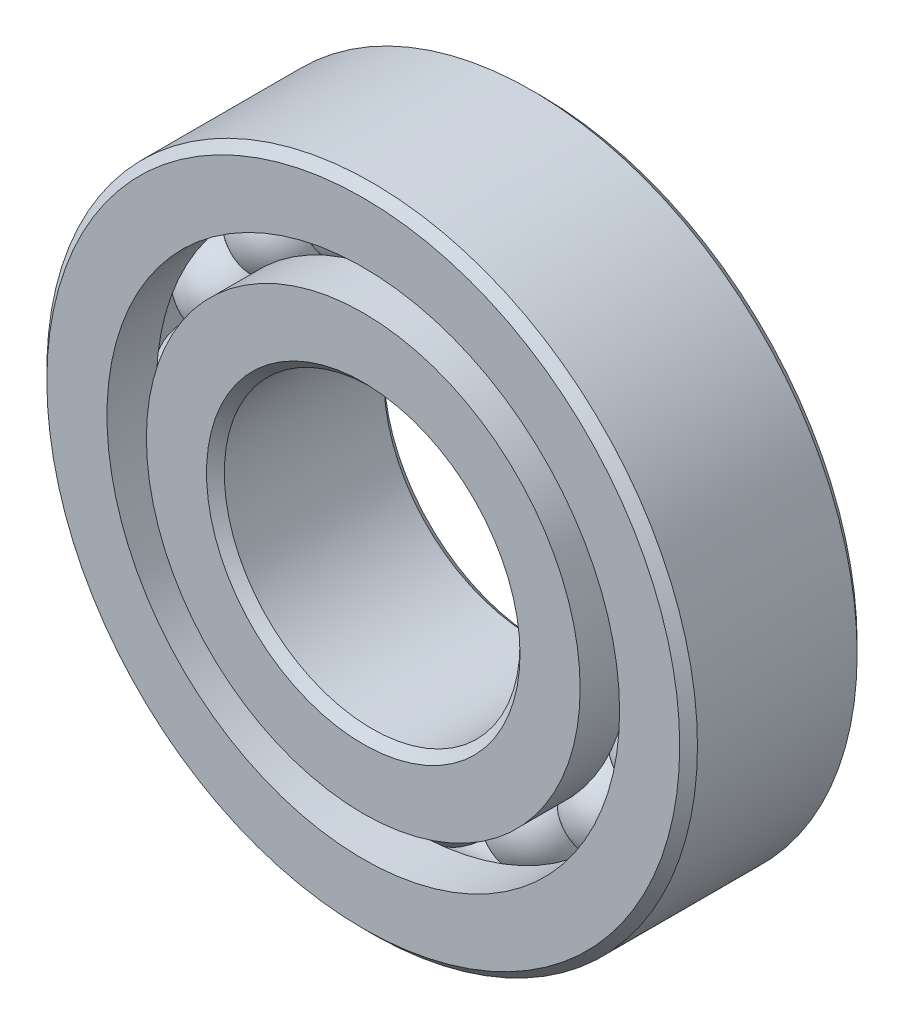
ISO-10303-21;
HEADER;
FILE_DESCRIPTION(('STEP AP214'),'2;1');
FILE_NAME('part.step','',(''),(''),'','','');
FILE_SCHEMA(('AUTOMOTIVE_DESIGN { 1 0 10303 214 1 1 1 1 }'));
ENDSEC;
DATA;
#1=APPLICATION_CONTEXT('core data for automotive mechanical design processes');
#2=APPLICATION_PROTOCOL_DEFINITION('international standard','automotive_design',2000,#1);
#3=PRODUCT_CONTEXT('',#1,'mechanical');
#4=PRODUCT('Part','Part','',(#3));
#5=PRODUCT_RELATED_PRODUCT_CATEGORY('part','',(#4));
#6=PRODUCT_DEFINITION_FORMATION('','',#4);
#7=PRODUCT_DEFINITION_CONTEXT('part definition',#1,'design');
#8=PRODUCT_DEFINITION('design','',#6,#7);
#9=PRODUCT_DEFINITION_SHAPE('','',#8);
#10=(LENGTH_UNIT() NAMED_UNIT(*) SI_UNIT(.MILLI.,.METRE.));
#11=(NAMED_UNIT(*) PLANE_ANGLE_UNIT() SI_UNIT($,.RADIAN.));
#12=(NAMED_UNIT(*) SI_UNIT($,.STERADIAN.) SOLID_ANGLE_UNIT());
#13=UNCERTAINTY_MEASURE_WITH_UNIT(LENGTH_MEASURE(1.E-05),#10,'distance_accuracy_value','');
#14=(GEOMETRIC_REPRESENTATION_CONTEXT(3) GLOBAL_UNCERTAINTY_ASSIGNED_CONTEXT((#13)) GLOBAL_UNIT_ASSIGNED_CONTEXT((#10,
#11,#12)) REPRESENTATION_CONTEXT('',''));
#15=CARTESIAN_POINT('',(0.,0.,0.));
#16=DIRECTION('',(0.,0.,1.));
#17=DIRECTION('',(1.,0.,0.));
#18=AXIS2_PLACEMENT_3D('',#15,#16,#17);
#19=CARTESIAN_POINT('',(-1.53073372946031,3.69551813004517,0.));
#20=DIRECTION('',(0.,0.,1.));
#21=DIRECTION('',(-0.382683432365077,0.923879532511292,0.));
#22=AXIS2_PLACEMENT_3D('',#19,#20,#21);
#23=SPHERICAL_SURFACE('',#22,0.74535599249993);
#24=CARTESIAN_POINT('',(-1.53073372946031,3.69551813004517,0.74535599249993));
#25=VERTEX_POINT('',#24);
#26=VERTEX_LOOP('',#25);
#27=FACE_BOUND('',#26,.T.);
#28=ADVANCED_FACE('F37',(#27),#23,.T.);
#29=CLOSED_SHELL('',(#28));
#30=MANIFOLD_SOLID_BREP('B2',#29);
#31=CARTESIAN_POINT('',(-2.82842712474616,2.82842712474622,0.));
#32=DIRECTION('',(0.,0.,1.));
#33=DIRECTION('',(-0.707106781186539,0.707106781186556,0.));
#34=AXIS2_PLACEMENT_3D('',#31,#32,#33);
#35=SPHERICAL_SURFACE('',#34,0.74535599249993);
#36=CARTESIAN_POINT('',(-2.82842712474616,2.82842712474622,0.74535599249993));
#37=VERTEX_POINT('',#36);
#38=VERTEX_LOOP('',#37);
#39=FACE_BOUND('',#38,.T.);
#40=ADVANCED_FACE('F68',(#39),#35,.T.);
#41=CLOSED_SHELL('',(#40));
#42=MANIFOLD_SOLID_BREP('B6',#41);
#43=CARTESIAN_POINT('',(-3.69551813004513,1.5307337294604,0.));
#44=DIRECTION('',(0.,0.,1.));
#45=DIRECTION('',(-0.923879532511283,0.3826834323651,0.));
#46=AXIS2_PLACEMENT_3D('',#43,#44,#45);
#47=SPHERICAL_SURFACE('',#46,0.74535599249993);
#48=CARTESIAN_POINT('',(-3.69551813004513,1.5307337294604,0.74535599249993));
#49=VERTEX_POINT('',#48);
#50=VERTEX_LOOP('',#49);
#51=FACE_BOUND('',#50,.T.);
#52=ADVANCED_FACE('F99',(#51),#47,.T.);
#53=CLOSED_SHELL('',(#52));
#54=MANIFOLD_SOLID_BREP('B33',#53);
#55=CARTESIAN_POINT('',(-4.,0.,0.));
#56=DIRECTION('',(0.,0.,1.));
#57=DIRECTION('',(-1.,0.,0.));
#58=AXIS2_PLACEMENT_3D('',#55,#56,#57);
#59=SPHERICAL_SURFACE('',#58,0.74535599249993);
#60=CARTESIAN_POINT('',(-4.,0.,0.74535599249993));
#61=VERTEX_POINT('',#60);
#62=VERTEX_LOOP('',#61);
#63=FACE_BOUND('',#62,.T.);
#64=ADVANCED_FACE('F130',(#63),#59,.T.);
#65=CLOSED_SHELL('',(#64));
#66=MANIFOLD_SOLID_BREP('B64',#65);
#67=CARTESIAN_POINT('',(-3.69551813004516,-1.53073372946032,0.));
#68=DIRECTION('',(0.,0.,1.));
#69=DIRECTION('',(-0.923879532511291,-0.382683432365081,0.));
#70=AXIS2_PLACEMENT_3D('',#67,#68,#69);
#71=SPHERICAL_SURFACE('',#70,0.74535599249993);
#72=CARTESIAN_POINT('',(-3.69551813004516,-1.53073372946032,0.74535599249993));
#73=VERTEX_POINT('',#72);
#74=VERTEX_LOOP('',#73);
#75=FACE_BOUND('',#74,.T.);
#76=ADVANCED_FACE('F161',(#75),#71,.T.);
#77=CLOSED_SHELL('',(#76));
#78=MANIFOLD_SOLID_BREP('B95',#77);
#79=CARTESIAN_POINT('',(-2.82842712474621,-2.82842712474617,0.));
#80=DIRECTION('',(0.,0.,1.));
#81=DIRECTION('',(-0.707106781186554,-0.707106781186541,0.));
#82=AXIS2_PLACEMENT_3D('',#79,#80,#81);
#83=SPHERICAL_SURFACE('',#82,0.74535599249993);
#84=CARTESIAN_POINT('',(-2.82842712474621,-2.82842712474617,0.74535599249993));
#85=VERTEX_POINT('',#84);
#86=VERTEX_LOOP('',#85);
#87=FACE_BOUND('',#86,.T.);
#88=ADVANCED_FACE('F192',(#87),#83,.T.);
#89=CLOSED_SHELL('',(#88));
#90=MANIFOLD_SOLID_BREP('B126',#89);
#91=CARTESIAN_POINT('',(-1.53073372946039,-3.69551813004513,0.));
#92=DIRECTION('',(0.,0.,1.));
#93=DIRECTION('',(-0.382683432365097,-0.923879532511284,0.));
#94=AXIS2_PLACEMENT_3D('',#91,#92,#93);
#95=SPHERICAL_SURFACE('',#94,0.74535599249993);
#96=CARTESIAN_POINT('',(-1.53073372946039,-3.69551813004513,0.74535599249993));
#97=VERTEX_POINT('',#96);
#98=VERTEX_LOOP('',#97);
#99=FACE_BOUND('',#98,.T.);
#100=ADVANCED_FACE('F223',(#99),#95,.T.);
#101=CLOSED_SHELL('',(#100));
#102=MANIFOLD_SOLID_BREP('B157',#101);
#103=CARTESIAN_POINT('',(0.,-4.,0.));
#104=DIRECTION('',(0.,0.,1.));
#105=DIRECTION('',(0.,-1.,0.));
#106=AXIS2_PLACEMENT_3D('',#103,#104,#105);
#107=SPHERICAL_SURFACE('',#106,0.74535599249993);
#108=CARTESIAN_POINT('',(0.,-4.,0.74535599249993));
#109=VERTEX_POINT('',#108);
#110=VERTEX_LOOP('',#109);
#111=FACE_BOUND('',#110,.T.);
#112=ADVANCED_FACE('F254',(#111),#107,.T.);
#113=CLOSED_SHELL('',(#112));
#114=MANIFOLD_SOLID_BREP('B188',#113);
#115=CARTESIAN_POINT('',(1.53073372946034,-3.69551813004516,0.));
#116=DIRECTION('',(0.,0.,1.));
#117=DIRECTION('',(0.382683432365084,-0.923879532511289,0.));
#118=AXIS2_PLACEMENT_3D('',#115,#116,#117);
#119=SPHERICAL_SURFACE('',#118,0.74535599249993);
#120=CARTESIAN_POINT('',(1.53073372946034,-3.69551813004516,0.74535599249993));
#121=VERTEX_POINT('',#120);
#122=VERTEX_LOOP('',#121);
#123=FACE_BOUND('',#122,.T.);
#124=ADVANCED_FACE('F285',(#123),#119,.T.);
#125=CLOSED_SHELL('',(#124));
#126=MANIFOLD_SOLID_BREP('B219',#125);
#127=CARTESIAN_POINT('',(2.82842712474618,-2.8284271247462,0.));
#128=DIRECTION('',(0.,0.,1.));
#129=DIRECTION('',(0.707106781186544,-0.707106781186551,0.));
#130=AXIS2_PLACEMENT_3D('',#127,#128,#129);
#131=SPHERICAL_SURFACE('',#130,0.74535599249993);
#132=CARTESIAN_POINT('',(2.82842712474618,-2.8284271247462,0.74535599249993));
#133=VERTEX_POINT('',#132);
#134=VERTEX_LOOP('',#133);
#135=FACE_BOUND('',#134,.T.);
#136=ADVANCED_FACE('F316',(#135),#131,.T.);
#137=CLOSED_SHELL('',(#136));
#138=MANIFOLD_SOLID_BREP('B250',#137);
#139=CARTESIAN_POINT('',(3.69551813004514,-1.53073372946038,0.));
#140=DIRECTION('',(0.,0.,1.));
#141=DIRECTION('',(0.923879532511285,-0.382683432365094,0.));
#142=AXIS2_PLACEMENT_3D('',#139,#140,#141);
#143=SPHERICAL_SURFACE('',#142,0.74535599249993);
#144=CARTESIAN_POINT('',(3.69551813004514,-1.53073372946038,0.74535599249993));
#145=VERTEX_POINT('',#144);
#146=VERTEX_LOOP('',#145);
#147=FACE_BOUND('',#146,.T.);
#148=ADVANCED_FACE('F347',(#147),#143,.T.);
#149=CLOSED_SHELL('',(#148));
#150=MANIFOLD_SOLID_BREP('B281',#149);
#151=CARTESIAN_POINT('',(4.,0.,0.));
#152=DIRECTION('',(0.,0.,1.));
#153=DIRECTION('',(1.,0.,0.));
#154=AXIS2_PLACEMENT_3D('',#151,#152,#153);
#155=SPHERICAL_SURFACE('',#154,0.74535599249993);
#156=CARTESIAN_POINT('',(4.,0.,0.74535599249993));
#157=VERTEX_POINT('',#156);
#158=VERTEX_LOOP('',#157);
#159=FACE_BOUND('',#158,.T.);
#160=ADVANCED_FACE('F378',(#159),#155,.T.);
#161=CLOSED_SHELL('',(#160));
#162=MANIFOLD_SOLID_BREP('B312',#161);
#163=CARTESIAN_POINT('',(3.69551813004515,1.53073372946035,0.));
#164=DIRECTION('',(0.,0.,1.));
#165=DIRECTION('',(0.923879532511288,0.382683432365087,0.));
#166=AXIS2_PLACEMENT_3D('',#163,#164,#165);
#167=SPHERICAL_SURFACE('',#166,0.74535599249993);
#168=CARTESIAN_POINT('',(3.69551813004515,1.53073372946035,0.74535599249993));
#169=VERTEX_POINT('',#168);
#170=VERTEX_LOOP('',#169);
#171=FACE_BOUND('',#170,.T.);
#172=ADVANCED_FACE('F409',(#171),#167,.T.);
#173=CLOSED_SHELL('',(#172));
#174=MANIFOLD_SOLID_BREP('B343',#173);
#175=CARTESIAN_POINT('',(2.8284271247462,2.82842712474619,0.));
#176=DIRECTION('',(0.,0.,1.));
#177=DIRECTION('',(0.707106781186549,0.707106781186546,0.));
#178=AXIS2_PLACEMENT_3D('',#175,#176,#177);
#179=SPHERICAL_SURFACE('',#178,0.74535599249993);
#180=CARTESIAN_POINT('',(2.8284271247462,2.82842712474619,0.74535599249993));
#181=VERTEX_POINT('',#180);
#182=VERTEX_LOOP('',#181);
#183=FACE_BOUND('',#182,.T.);
#184=ADVANCED_FACE('F440',(#183),#179,.T.);
#185=CLOSED_SHELL('',(#184));
#186=MANIFOLD_SOLID_BREP('B374',#185);
#187=CARTESIAN_POINT('',(1.53073372946036,3.69551813004515,0.));
#188=DIRECTION('',(0.,0.,1.));
#189=DIRECTION('',(0.382683432365091,0.923879532511287,0.));
#190=AXIS2_PLACEMENT_3D('',#187,#188,#189);
#191=SPHERICAL_SURFACE('',#190,0.74535599249993);
#192=CARTESIAN_POINT('',(1.53073372946036,3.69551813004515,0.74535599249993));
#193=VERTEX_POINT('',#192);
#194=VERTEX_LOOP('',#193);
#195=FACE_BOUND('',#194,.T.);
#196=ADVANCED_FACE('F471',(#195),#191,.T.);
#197=CLOSED_SHELL('',(#196));
#198=MANIFOLD_SOLID_BREP('B405',#197);
#199=CARTESIAN_POINT('',(0.,4.,0.));
#200=DIRECTION('',(0.,0.,1.));
#201=DIRECTION('',(0.,1.,0.));
#202=AXIS2_PLACEMENT_3D('',#199,#200,#201);
#203=SPHERICAL_SURFACE('',#202,0.74535599249993);
#204=CARTESIAN_POINT('',(0.,4.,0.74535599249993));
#205=VERTEX_POINT('',#204);
#206=VERTEX_LOOP('',#205);
#207=FACE_BOUND('',#206,.T.);
#208=ADVANCED_FACE('F504',(#207),#203,.T.);
#209=CLOSED_SHELL('',(#208));
#210=MANIFOLD_SOLID_BREP('B436',#209);
#211=CARTESIAN_POINT('',(0.,0.,1.35));
#212=DIRECTION('',(0.,0.,-1.));
#213=DIRECTION('',(-1.,0.,0.));
#214=AXIS2_PLACEMENT_3D('',#211,#212,#213);
#215=CONICAL_SURFACE('',#214,5.5,0.785398163397445);
#216=CARTESIAN_POINT('',(0.,0.,1.5));
#217=DIRECTION('',(0.,0.,1.));
#218=DIRECTION('',(1.,0.,0.));
#219=AXIS2_PLACEMENT_3D('',#216,#217,#218);
#220=CIRCLE('',#219,5.35);
#221=CARTESIAN_POINT('',(5.35,0.,1.5));
#222=VERTEX_POINT('',#221);
#223=EDGE_CURVE('E551',#222,#222,#220,.T.);
#224=ORIENTED_EDGE('',*,*,#223,.F.);
#225=EDGE_LOOP('',(#224));
#226=FACE_BOUND('',#225,.T.);
#227=CARTESIAN_POINT('',(0.,0.,1.35));
#228=DIRECTION('',(0.,0.,1.));
#229=DIRECTION('',(1.,0.,0.));
#230=AXIS2_PLACEMENT_3D('',#227,#228,#229);
#231=CIRCLE('',#230,5.5);
#232=CARTESIAN_POINT('',(5.5,0.,1.35));
#233=VERTEX_POINT('',#232);
#234=EDGE_CURVE('E503',#233,#233,#231,.T.);
#235=ORIENTED_EDGE('',*,*,#234,.T.);
#236=EDGE_LOOP('',(#235));
#237=FACE_BOUND('',#236,.T.);
#238=ADVANCED_FACE('F523',(#226,#237),#215,.T.);
#239=CARTESIAN_POINT('',(0.,0.,1.5));
#240=DIRECTION('',(0.,0.,1.));
#241=DIRECTION('',(1.,0.,0.));
#242=AXIS2_PLACEMENT_3D('',#239,#240,#241);
#243=CYLINDRICAL_SURFACE('',#242,5.5);
#244=ORIENTED_EDGE('',*,*,#234,.F.);
#245=EDGE_LOOP('',(#244));
#246=FACE_BOUND('',#245,.T.);
#247=CARTESIAN_POINT('',(0.,0.,-1.35));
#248=DIRECTION('',(0.,0.,1.));
#249=DIRECTION('',(1.,0.,0.));
#250=AXIS2_PLACEMENT_3D('',#247,#248,#249);
#251=CIRCLE('',#250,5.5);
#252=CARTESIAN_POINT('',(5.5,0.,-1.35));
#253=VERTEX_POINT('',#252);
#254=EDGE_CURVE('E529',#253,#253,#251,.T.);
#255=ORIENTED_EDGE('',*,*,#254,.T.);
#256=EDGE_LOOP('',(#255));
#257=FACE_BOUND('',#256,.T.);
#258=ADVANCED_FACE('F558',(#246,#257),#243,.T.);
#259=CARTESIAN_POINT('',(0.,0.,-1.5));
#260=DIRECTION('',(0.,0.,1.));
#261=DIRECTION('',(1.,0.,0.));
#262=AXIS2_PLACEMENT_3D('',#259,#260,#261);
#263=CONICAL_SURFACE('',#262,5.35,0.785398163397445);
#264=ORIENTED_EDGE('',*,*,#254,.F.);
#265=EDGE_LOOP('',(#264));
#266=FACE_BOUND('',#265,.T.);
#267=CARTESIAN_POINT('',(0.,0.,-1.5));
#268=DIRECTION('',(0.,0.,1.));
#269=DIRECTION('',(1.,0.,0.));
#270=AXIS2_PLACEMENT_3D('',#267,#268,#269);
#271=CIRCLE('',#270,5.35);
#272=CARTESIAN_POINT('',(5.35,0.,-1.5));
#273=VERTEX_POINT('',#272);
#274=EDGE_CURVE('E533',#273,#273,#271,.T.);
#275=ORIENTED_EDGE('',*,*,#274,.T.);
#276=EDGE_LOOP('',(#275));
#277=FACE_BOUND('',#276,.T.);
#278=ADVANCED_FACE('F562',(#266,#277),#263,.T.);
#279=CARTESIAN_POINT('',(0.,5.35,-1.5));
#280=DIRECTION('',(0.,0.,1.));
#281=DIRECTION('',(1.,0.,0.));
#282=AXIS2_PLACEMENT_3D('',#279,#280,#281);
#283=PLANE('',#282);
#284=ORIENTED_EDGE('',*,*,#274,.F.);
#285=EDGE_LOOP('',(#284));
#286=FACE_BOUND('',#285,.T.);
#287=CARTESIAN_POINT('',(0.,0.,-1.5));
#288=DIRECTION('',(0.,0.,1.));
#289=DIRECTION('',(1.,0.,0.));
#290=AXIS2_PLACEMENT_3D('',#287,#288,#289);
#291=CIRCLE('',#290,4.33333333333333);
#292=CARTESIAN_POINT('',(4.33333333333333,0.,-1.5));
#293=VERTEX_POINT('',#292);
#294=EDGE_CURVE('E537',#293,#293,#291,.T.);
#295=ORIENTED_EDGE('',*,*,#294,.T.);
#296=EDGE_LOOP('',(#295));
#297=FACE_BOUND('',#296,.T.);
#298=ADVANCED_FACE('F567',(#286,#297),#283,.F.);
#299=CARTESIAN_POINT('',(0.,0.,1.5));
#300=DIRECTION('',(0.,0.,1.));
#301=DIRECTION('',(1.,0.,0.));
#302=AXIS2_PLACEMENT_3D('',#299,#300,#301);
#303=CYLINDRICAL_SURFACE('',#302,4.33333333333333);
#304=ORIENTED_EDGE('',*,*,#294,.F.);
#305=EDGE_LOOP('',(#304));
#306=FACE_BOUND('',#305,.T.);
#307=CARTESIAN_POINT('',(0.,0.,-0.666666666666667));
#308=DIRECTION('',(0.,0.,1.));
#309=DIRECTION('',(1.,0.,0.));
#310=AXIS2_PLACEMENT_3D('',#307,#308,#309);
#311=CIRCLE('',#310,4.33333333333333);
#312=CARTESIAN_POINT('',(4.33333333333333,0.,-0.666666666666667));
#313=VERTEX_POINT('',#312);
#314=EDGE_CURVE('E542',#313,#313,#311,.T.);
#315=ORIENTED_EDGE('',*,*,#314,.T.);
#316=EDGE_LOOP('',(#315));
#317=FACE_BOUND('',#316,.T.);
#318=ADVANCED_FACE('F573',(#306,#317),#303,.F.);
#319=CARTESIAN_POINT('',(0.,0.,0.));
#320=DIRECTION('',(0.,0.,1.));
#321=DIRECTION('',(1.,0.,0.));
#322=AXIS2_PLACEMENT_3D('',#319,#320,#321);
#323=TOROIDAL_SURFACE('',#322,4.,0.745355992499928);
#324=ORIENTED_EDGE('',*,*,#314,.F.);
#325=EDGE_LOOP('',(#324));
#326=FACE_BOUND('',#325,.T.);
#327=CARTESIAN_POINT('',(0.,0.,0.666666666666667));
#328=DIRECTION('',(0.,0.,1.));
#329=DIRECTION('',(1.,0.,0.));
#330=AXIS2_PLACEMENT_3D('',#327,#328,#329);
#331=CIRCLE('',#330,4.33333333333333);
#332=CARTESIAN_POINT('',(4.33333333333333,0.,0.666666666666667));
#333=VERTEX_POINT('',#332);
#334=EDGE_CURVE('E545',#333,#333,#331,.T.);
#335=ORIENTED_EDGE('',*,*,#334,.T.);
#336=EDGE_LOOP('',(#335));
#337=FACE_BOUND('',#336,.T.);
#338=ADVANCED_FACE('F577',(#326,#337),#323,.F.);
#339=CARTESIAN_POINT('',(0.,0.,1.5));
#340=DIRECTION('',(0.,0.,1.));
#341=DIRECTION('',(1.,0.,0.));
#342=AXIS2_PLACEMENT_3D('',#339,#340,#341);
#343=CYLINDRICAL_SURFACE('',#342,4.33333333333333);
#344=ORIENTED_EDGE('',*,*,#334,.F.);
#345=EDGE_LOOP('',(#344));
#346=FACE_BOUND('',#345,.T.);
#347=CARTESIAN_POINT('',(0.,0.,1.5));
#348=DIRECTION('',(0.,0.,1.));
#349=DIRECTION('',(1.,0.,0.));
#350=AXIS2_PLACEMENT_3D('',#347,#348,#349);
#351=CIRCLE('',#350,4.33333333333333);
#352=CARTESIAN_POINT('',(4.33333333333333,0.,1.5));
#353=VERTEX_POINT('',#352);
#354=EDGE_CURVE('E548',#353,#353,#351,.T.);
#355=ORIENTED_EDGE('',*,*,#354,.T.);
#356=EDGE_LOOP('',(#355));
#357=FACE_BOUND('',#356,.T.);
#358=ADVANCED_FACE('F581',(#346,#357),#343,.F.);
#359=CARTESIAN_POINT('',(0.,5.35,1.5));
#360=DIRECTION('',(0.,0.,-1.));
#361=DIRECTION('',(-1.,0.,0.));
#362=AXIS2_PLACEMENT_3D('',#359,#360,#361);
#363=PLANE('',#362);
#364=ORIENTED_EDGE('',*,*,#354,.F.);
#365=EDGE_LOOP('',(#364));
#366=FACE_BOUND('',#365,.T.);
#367=ORIENTED_EDGE('',*,*,#223,.T.);
#368=EDGE_LOOP('',(#367));
#369=FACE_BOUND('',#368,.T.);
#370=ADVANCED_FACE('F555',(#366,#369),#363,.F.);
#371=CLOSED_SHELL('',(#238,#258,#278,#298,#318,#338,#358,#370));
#372=MANIFOLD_SOLID_BREP('B467',#371);
#373=CARTESIAN_POINT('',(0.,3.66666666666667,1.5));
#374=DIRECTION('',(0.,0.,-1.));
#375=DIRECTION('',(-1.,0.,0.));
#376=AXIS2_PLACEMENT_3D('',#373,#374,#375);
#377=PLANE('',#376);
#378=CARTESIAN_POINT('',(0.,0.,1.5));
#379=DIRECTION('',(0.,0.,1.));
#380=DIRECTION('',(1.,0.,0.));
#381=AXIS2_PLACEMENT_3D('',#378,#379,#380);
#382=CIRCLE('',#381,2.65);
#383=CARTESIAN_POINT('',(2.65,0.,1.5));
#384=VERTEX_POINT('',#383);
#385=EDGE_CURVE('E522',#384,#384,#382,.T.);
#386=ORIENTED_EDGE('',*,*,#385,.F.);
#387=EDGE_LOOP('',(#386));
#388=FACE_BOUND('',#387,.T.);
#389=CARTESIAN_POINT('',(0.,0.,1.5));
#390=DIRECTION('',(0.,0.,1.));
#391=DIRECTION('',(1.,0.,0.));
#392=AXIS2_PLACEMENT_3D('',#389,#390,#391);
#393=CIRCLE('',#392,3.66666666666667);
#394=CARTESIAN_POINT('',(3.66666666666667,0.,1.5));
#395=VERTEX_POINT('',#394);
#396=EDGE_CURVE('E672',#395,#395,#393,.T.);
#397=ORIENTED_EDGE('',*,*,#396,.T.);
#398=EDGE_LOOP('',(#397));
#399=FACE_BOUND('',#398,.T.);
#400=ADVANCED_FACE('F644',(#388,#399),#377,.F.);
#401=CARTESIAN_POINT('',(0.,0.,1.5));
#402=DIRECTION('',(0.,0.,1.));
#403=DIRECTION('',(1.,0.,0.));
#404=AXIS2_PLACEMENT_3D('',#401,#402,#403);
#405=CONICAL_SURFACE('',#404,2.65,0.785398163397448);
#406=CARTESIAN_POINT('',(0.,0.,1.35));
#407=DIRECTION('',(0.,0.,1.));
#408=DIRECTION('',(1.,0.,0.));
#409=AXIS2_PLACEMENT_3D('',#406,#407,#408);
#410=CIRCLE('',#409,2.5);
#411=CARTESIAN_POINT('',(2.5,0.,1.35));
#412=VERTEX_POINT('',#411);
#413=EDGE_CURVE('E650',#412,#412,#410,.T.);
#414=ORIENTED_EDGE('',*,*,#413,.F.);
#415=EDGE_LOOP('',(#414));
#416=FACE_BOUND('',#415,.T.);
#417=ORIENTED_EDGE('',*,*,#385,.T.);
#418=EDGE_LOOP('',(#417));
#419=FACE_BOUND('',#418,.T.);
#420=ADVANCED_FACE('F709',(#416,#419),#405,.F.);
#421=CARTESIAN_POINT('',(0.,0.,1.5));
#422=DIRECTION('',(0.,0.,1.));
#423=DIRECTION('',(1.,0.,0.));
#424=AXIS2_PLACEMENT_3D('',#421,#422,#423);
#425=CYLINDRICAL_SURFACE('',#424,2.5);
#426=CARTESIAN_POINT('',(0.,0.,-1.35));
#427=DIRECTION('',(0.,0.,1.));
#428=DIRECTION('',(1.,0.,0.));
#429=AXIS2_PLACEMENT_3D('',#426,#427,#428);
#430=CIRCLE('',#429,2.5);
#431=CARTESIAN_POINT('',(2.5,0.,-1.35));
#432=VERTEX_POINT('',#431);
#433=EDGE_CURVE('E654',#432,#432,#430,.T.);
#434=ORIENTED_EDGE('',*,*,#433,.F.);
#435=EDGE_LOOP('',(#434));
#436=FACE_BOUND('',#435,.T.);
#437=ORIENTED_EDGE('',*,*,#413,.T.);
#438=EDGE_LOOP('',(#437));
#439=FACE_BOUND('',#438,.T.);
#440=ADVANCED_FACE('F704',(#436,#439),#425,.F.);
#441=CARTESIAN_POINT('',(0.,0.,-1.35));
#442=DIRECTION('',(0.,0.,-1.));
#443=DIRECTION('',(-1.,0.,0.));
#444=AXIS2_PLACEMENT_3D('',#441,#442,#443);
#445=CONICAL_SURFACE('',#444,2.5,0.785398163397447);
#446=CARTESIAN_POINT('',(0.,0.,-1.5));
#447=DIRECTION('',(0.,0.,1.));
#448=DIRECTION('',(1.,0.,0.));
#449=AXIS2_PLACEMENT_3D('',#446,#447,#448);
#450=CIRCLE('',#449,2.65);
#451=CARTESIAN_POINT('',(2.65,0.,-1.5));
#452=VERTEX_POINT('',#451);
#453=EDGE_CURVE('E658',#452,#452,#450,.T.);
#454=ORIENTED_EDGE('',*,*,#453,.F.);
#455=EDGE_LOOP('',(#454));
#456=FACE_BOUND('',#455,.T.);
#457=ORIENTED_EDGE('',*,*,#433,.T.);
#458=EDGE_LOOP('',(#457));
#459=FACE_BOUND('',#458,.T.);
#460=ADVANCED_FACE('F698',(#456,#459),#445,.F.);
#461=CARTESIAN_POINT('',(0.,3.66666666666667,-1.5));
#462=DIRECTION('',(0.,0.,1.));
#463=DIRECTION('',(1.,0.,0.));
#464=AXIS2_PLACEMENT_3D('',#461,#462,#463);
#465=PLANE('',#464);
#466=CARTESIAN_POINT('',(0.,0.,-1.5));
#467=DIRECTION('',(0.,0.,1.));
#468=DIRECTION('',(1.,0.,0.));
#469=AXIS2_PLACEMENT_3D('',#466,#467,#468);
#470=CIRCLE('',#469,3.66666666666667);
#471=CARTESIAN_POINT('',(3.66666666666667,0.,-1.5));
#472=VERTEX_POINT('',#471);
#473=EDGE_CURVE('E663',#472,#472,#470,.T.);
#474=ORIENTED_EDGE('',*,*,#473,.F.);
#475=EDGE_LOOP('',(#474));
#476=FACE_BOUND('',#475,.T.);
#477=ORIENTED_EDGE('',*,*,#453,.T.);
#478=EDGE_LOOP('',(#477));
#479=FACE_BOUND('',#478,.T.);
#480=ADVANCED_FACE('F692',(#476,#479),#465,.F.);
#481=CARTESIAN_POINT('',(0.,0.,1.5));
#482=DIRECTION('',(0.,0.,1.));
#483=DIRECTION('',(1.,0.,0.));
#484=AXIS2_PLACEMENT_3D('',#481,#482,#483);
#485=CYLINDRICAL_SURFACE('',#484,3.66666666666667);
#486=CARTESIAN_POINT('',(0.,0.,-0.666666666666667));
#487=DIRECTION('',(0.,0.,1.));
#488=DIRECTION('',(1.,0.,0.));
#489=AXIS2_PLACEMENT_3D('',#486,#487,#488);
#490=CIRCLE('',#489,3.66666666666667);
#491=CARTESIAN_POINT('',(3.66666666666667,0.,-0.666666666666667));
#492=VERTEX_POINT('',#491);
#493=EDGE_CURVE('E666',#492,#492,#490,.T.);
#494=ORIENTED_EDGE('',*,*,#493,.F.);
#495=EDGE_LOOP('',(#494));
#496=FACE_BOUND('',#495,.T.);
#497=ORIENTED_EDGE('',*,*,#473,.T.);
#498=EDGE_LOOP('',(#497));
#499=FACE_BOUND('',#498,.T.);
#500=ADVANCED_FACE('F686',(#496,#499),#485,.T.);
#501=CARTESIAN_POINT('',(0.,0.,0.));
#502=DIRECTION('',(0.,0.,1.));
#503=DIRECTION('',(1.,0.,0.));
#504=AXIS2_PLACEMENT_3D('',#501,#502,#503);
#505=TOROIDAL_SURFACE('',#504,4.,0.74535599249993);
#506=CARTESIAN_POINT('',(0.,0.,0.666666666666667));
#507=DIRECTION('',(0.,0.,1.));
#508=DIRECTION('',(1.,0.,0.));
#509=AXIS2_PLACEMENT_3D('',#506,#507,#508);
#510=CIRCLE('',#509,3.66666666666667);
#511=CARTESIAN_POINT('',(3.66666666666667,0.,0.666666666666667));
#512=VERTEX_POINT('',#511);
#513=EDGE_CURVE('E669',#512,#512,#510,.T.);
#514=ORIENTED_EDGE('',*,*,#513,.F.);
#515=EDGE_LOOP('',(#514));
#516=FACE_BOUND('',#515,.T.);
#517=ORIENTED_EDGE('',*,*,#493,.T.);
#518=EDGE_LOOP('',(#517));
#519=FACE_BOUND('',#518,.T.);
#520=ADVANCED_FACE('F680',(#516,#519),#505,.F.);
#521=CARTESIAN_POINT('',(0.,0.,1.5));
#522=DIRECTION('',(0.,0.,1.));
#523=DIRECTION('',(1.,0.,0.));
#524=AXIS2_PLACEMENT_3D('',#521,#522,#523);
#525=CYLINDRICAL_SURFACE('',#524,3.66666666666667);
#526=ORIENTED_EDGE('',*,*,#396,.F.);
#527=EDGE_LOOP('',(#526));
#528=FACE_BOUND('',#527,.T.);
#529=ORIENTED_EDGE('',*,*,#513,.T.);
#530=EDGE_LOOP('',(#529));
#531=FACE_BOUND('',#530,.T.);
#532=ADVANCED_FACE('F677',(#528,#531),#525,.T.);
#533=CLOSED_SHELL('',(#400,#420,#440,#460,#480,#500,#520,#532));
#534=MANIFOLD_SOLID_BREP('B498',#533);
#535=ADVANCED_BREP_SHAPE_REPRESENTATION('',(#18,#30,#42,#54,#66,#78,#90,#102,#114,#126,#138,
#150,#162,#174,#186,#198,#210,#372,#534),#14);
#536=SHAPE_DEFINITION_REPRESENTATION(#9,#535);
ENDSEC;
END-ISO-10303-21;
